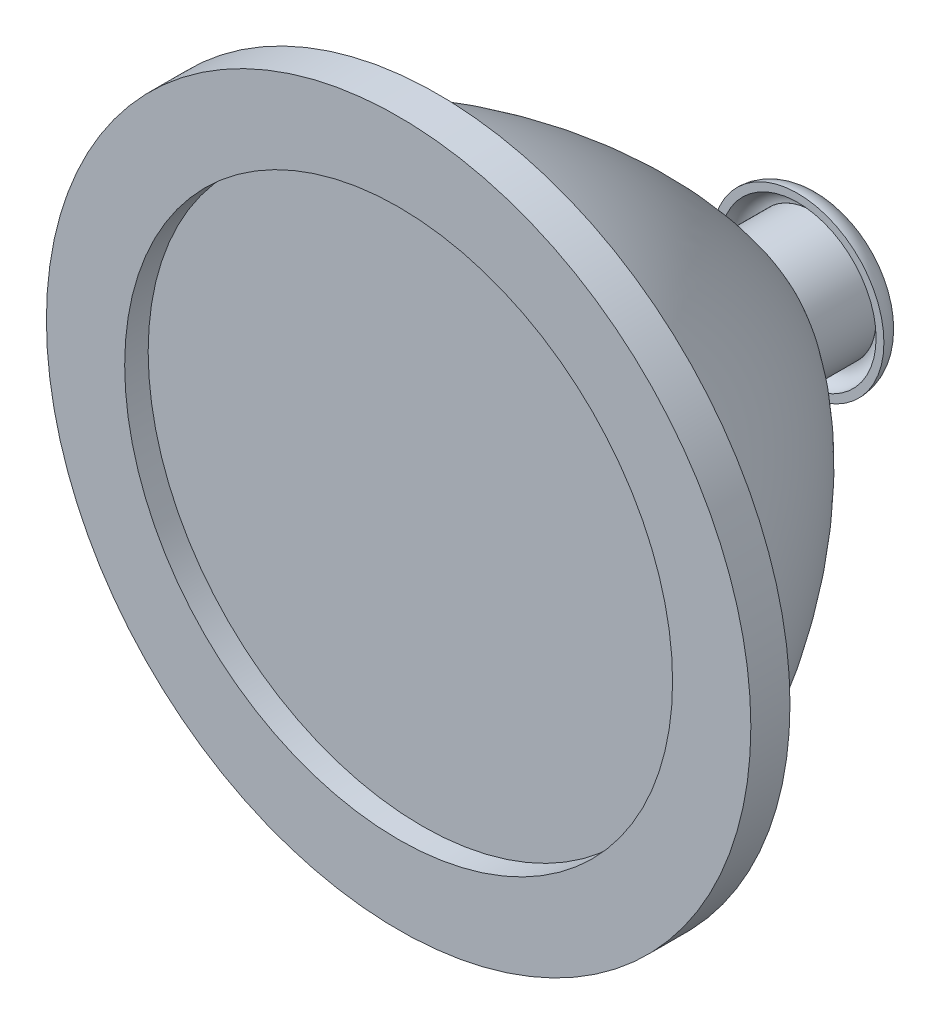
ISO-10303-21;
HEADER;
FILE_DESCRIPTION(('STEP AP214'),'2;1');
FILE_NAME('part.step','',(''),(''),'','','');
FILE_SCHEMA(('AUTOMOTIVE_DESIGN { 1 0 10303 214 1 1 1 1 }'));
ENDSEC;
DATA;
#1=APPLICATION_CONTEXT('core data for automotive mechanical design processes');
#2=APPLICATION_PROTOCOL_DEFINITION('international standard','automotive_design',2000,#1);
#3=PRODUCT_CONTEXT('',#1,'mechanical');
#4=PRODUCT('Part','Part','',(#3));
#5=PRODUCT_RELATED_PRODUCT_CATEGORY('part','',(#4));
#6=PRODUCT_DEFINITION_FORMATION('','',#4);
#7=PRODUCT_DEFINITION_CONTEXT('part definition',#1,'design');
#8=PRODUCT_DEFINITION('design','',#6,#7);
#9=PRODUCT_DEFINITION_SHAPE('','',#8);
#10=(LENGTH_UNIT() NAMED_UNIT(*) SI_UNIT(.MILLI.,.METRE.));
#11=(NAMED_UNIT(*) PLANE_ANGLE_UNIT() SI_UNIT($,.RADIAN.));
#12=(NAMED_UNIT(*) SI_UNIT($,.STERADIAN.) SOLID_ANGLE_UNIT());
#13=UNCERTAINTY_MEASURE_WITH_UNIT(LENGTH_MEASURE(1.E-05),#10,'distance_accuracy_value','');
#14=(GEOMETRIC_REPRESENTATION_CONTEXT(3) GLOBAL_UNCERTAINTY_ASSIGNED_CONTEXT((#13)) GLOBAL_UNIT_ASSIGNED_CONTEXT((#10,
#11,#12)) REPRESENTATION_CONTEXT('',''));
#15=CARTESIAN_POINT('',(0.,0.,0.));
#16=DIRECTION('',(0.,0.,1.));
#17=DIRECTION('',(1.,0.,0.));
#18=AXIS2_PLACEMENT_3D('',#15,#16,#17);
#19=CARTESIAN_POINT('',(0.,0.,-58.42));
#20=DIRECTION('',(0.,0.,1.));
#21=DIRECTION('',(1.,0.,0.));
#22=AXIS2_PLACEMENT_3D('',#19,#20,#21);
#23=TOROIDAL_SURFACE('',#22,10.16,3.81);
#24=CARTESIAN_POINT('',(0.,0.,-58.42));
#25=DIRECTION('',(0.,0.,1.));
#26=DIRECTION('',(1.,0.,0.));
#27=AXIS2_PLACEMENT_3D('',#24,#25,#26);
#28=CIRCLE('',#27,13.97);
#29=CARTESIAN_POINT('',(13.97,0.,-58.42));
#30=VERTEX_POINT('',#29);
#31=EDGE_CURVE('E11',#30,#30,#28,.T.);
#32=ORIENTED_EDGE('',*,*,#31,.F.);
#33=EDGE_LOOP('',(#32));
#34=FACE_BOUND('',#33,.T.);
#35=CARTESIAN_POINT('',(0.,0.,-62.23));
#36=DIRECTION('',(0.,0.,1.));
#37=DIRECTION('',(1.,0.,0.));
#38=AXIS2_PLACEMENT_3D('',#35,#36,#37);
#39=CIRCLE('',#38,10.16);
#40=CARTESIAN_POINT('',(10.16,0.,-62.23));
#41=VERTEX_POINT('',#40);
#42=EDGE_CURVE('E55',#41,#41,#39,.T.);
#43=ORIENTED_EDGE('',*,*,#42,.T.);
#44=EDGE_LOOP('',(#43));
#45=FACE_BOUND('',#44,.T.);
#46=ADVANCED_FACE('F41',(#34,#45),#23,.T.);
#47=CARTESIAN_POINT('',(0.,12.7,-58.42));
#48=DIRECTION('',(0.,0.,1.));
#49=DIRECTION('',(1.,0.,0.));
#50=AXIS2_PLACEMENT_3D('',#47,#48,#49);
#51=PLANE('',#50);
#52=ORIENTED_EDGE('',*,*,#31,.T.);
#53=EDGE_LOOP('',(#52));
#54=FACE_BOUND('',#53,.T.);
#55=CARTESIAN_POINT('',(0.,0.,-58.42));
#56=DIRECTION('',(0.,0.,1.));
#57=DIRECTION('',(1.,0.,0.));
#58=AXIS2_PLACEMENT_3D('',#55,#56,#57);
#59=CIRCLE('',#58,12.7);
#60=CARTESIAN_POINT('',(12.7,0.,-58.42));
#61=VERTEX_POINT('',#60);
#62=EDGE_CURVE('E47',#61,#61,#59,.T.);
#63=ORIENTED_EDGE('',*,*,#62,.F.);
#64=EDGE_LOOP('',(#63));
#65=FACE_BOUND('',#64,.T.);
#66=ADVANCED_FACE('F70',(#54,#65),#51,.T.);
#67=CARTESIAN_POINT('',(0.,0.,-58.42));
#68=DIRECTION('',(0.,0.,1.));
#69=DIRECTION('',(1.,0.,0.));
#70=AXIS2_PLACEMENT_3D('',#67,#68,#69);
#71=TOROIDAL_SURFACE('',#70,10.16,2.54);
#72=ORIENTED_EDGE('',*,*,#62,.T.);
#73=EDGE_LOOP('',(#72));
#74=FACE_BOUND('',#73,.T.);
#75=CARTESIAN_POINT('',(0.,0.,-60.96));
#76=DIRECTION('',(0.,0.,1.));
#77=DIRECTION('',(1.,0.,0.));
#78=AXIS2_PLACEMENT_3D('',#75,#76,#77);
#79=CIRCLE('',#78,10.16);
#80=CARTESIAN_POINT('',(10.16,0.,-60.96));
#81=VERTEX_POINT('',#80);
#82=EDGE_CURVE('E51',#81,#81,#79,.T.);
#83=ORIENTED_EDGE('',*,*,#82,.F.);
#84=EDGE_LOOP('',(#83));
#85=FACE_BOUND('',#84,.T.);
#86=ADVANCED_FACE('F64',(#74,#85),#71,.F.);
#87=CARTESIAN_POINT('',(0.,0.,0.));
#88=DIRECTION('',(0.,0.,1.));
#89=DIRECTION('',(1.,0.,0.));
#90=AXIS2_PLACEMENT_3D('',#87,#88,#89);
#91=CYLINDRICAL_SURFACE('',#90,10.16);
#92=ORIENTED_EDGE('',*,*,#82,.T.);
#93=EDGE_LOOP('',(#92));
#94=FACE_BOUND('',#93,.T.);
#95=ORIENTED_EDGE('',*,*,#42,.F.);
#96=EDGE_LOOP('',(#95));
#97=FACE_BOUND('',#96,.T.);
#98=ADVANCED_FACE('F62',(#94,#97),#91,.F.);
#99=CLOSED_SHELL('',(#46,#66,#86,#98));
#100=MANIFOLD_SOLID_BREP('B2',#99);
#101=CARTESIAN_POINT('',(0.,0.,34.7283102836008));
#102=DIRECTION('',(0.,0.,1.));
#103=DIRECTION('',(1.,0.,0.));
#104=AXIS2_PLACEMENT_3D('',#101,#102,#103);
#105=DEGENERATE_TOROIDAL_SURFACE('',#104,44.680387854501,101.6,.F.);
#106=CARTESIAN_POINT('',(0.,0.,0.));
#107=DIRECTION('',(0.,0.,1.));
#108=DIRECTION('',(1.,0.,0.));
#109=AXIS2_PLACEMENT_3D('',#106,#107,#108);
#110=CIRCLE('',#109,50.8);
#111=CARTESIAN_POINT('',(50.8,0.,0.));
#112=VERTEX_POINT('',#111);
#113=EDGE_CURVE('E109',#112,#112,#110,.T.);
#114=ORIENTED_EDGE('',*,*,#113,.F.);
#115=EDGE_LOOP('',(#114));
#116=FACE_BOUND('',#115,.T.);
#117=CARTESIAN_POINT('',(0.,0.,-50.8));
#118=DIRECTION('',(0.,0.,-1.));
#119=DIRECTION('',(-1.,0.,0.));
#120=AXIS2_PLACEMENT_3D('',#117,#118,#119);
#121=CIRCLE('',#120,10.16);
#122=CARTESIAN_POINT('',(-10.16,0.,-50.8));
#123=VERTEX_POINT('',#122);
#124=EDGE_CURVE('E120',#123,#123,#121,.T.);
#125=ORIENTED_EDGE('',*,*,#124,.F.);
#126=EDGE_LOOP('',(#125));
#127=FACE_BOUND('',#126,.T.);
#128=ADVANCED_FACE('F103',(#116,#127),#105,.F.);
#129=CARTESIAN_POINT('',(0.,0.,34.7283102836008));
#130=DIRECTION('',(0.,0.,1.));
#131=DIRECTION('',(1.,0.,0.));
#132=AXIS2_PLACEMENT_3D('',#129,#130,#131);
#133=DEGENERATE_TOROIDAL_SURFACE('',#132,44.680387854501,95.25,.F.);
#134=CARTESIAN_POINT('',(0.,0.,0.));
#135=DIRECTION('',(0.,0.,1.));
#136=DIRECTION('',(1.,0.,0.));
#137=AXIS2_PLACEMENT_3D('',#134,#135,#136);
#138=CIRCLE('',#137,44.0129431509694);
#139=CARTESIAN_POINT('',(44.0129431509694,0.,0.));
#140=VERTEX_POINT('',#139);
#141=EDGE_CURVE('E146',#140,#140,#138,.T.);
#142=ORIENTED_EDGE('',*,*,#141,.T.);
#143=EDGE_LOOP('',(#142));
#144=FACE_BOUND('',#143,.T.);
#145=CARTESIAN_POINT('',(0.,0.,-44.45));
#146=DIRECTION('',(0.,0.,1.));
#147=DIRECTION('',(1.,0.,0.));
#148=AXIS2_PLACEMENT_3D('',#145,#146,#147);
#149=CIRCLE('',#148,8.26635596071236);
#150=CARTESIAN_POINT('',(8.26635596071236,0.,-44.45));
#151=VERTEX_POINT('',#150);
#152=EDGE_CURVE('E113',#151,#151,#149,.T.);
#153=ORIENTED_EDGE('',*,*,#152,.F.);
#154=EDGE_LOOP('',(#153));
#155=FACE_BOUND('',#154,.T.);
#156=ADVANCED_FACE('F150',(#144,#155),#133,.T.);
#157=CARTESIAN_POINT('',(0.,0.,-44.45));
#158=DIRECTION('',(0.,0.,1.));
#159=DIRECTION('',(1.,0.,0.));
#160=AXIS2_PLACEMENT_3D('',#157,#158,#159);
#161=PLANE('',#160);
#162=CARTESIAN_POINT('',(0.,0.,-44.45));
#163=DIRECTION('',(0.,0.,1.));
#164=DIRECTION('',(1.,0.,0.));
#165=AXIS2_PLACEMENT_3D('',#162,#163,#164);
#166=CIRCLE('',#165,7.62);
#167=CARTESIAN_POINT('',(7.62,0.,-44.45));
#168=VERTEX_POINT('',#167);
#169=EDGE_CURVE('E134',#168,#168,#166,.T.);
#170=ORIENTED_EDGE('',*,*,#169,.F.);
#171=EDGE_LOOP('',(#170));
#172=FACE_BOUND('',#171,.T.);
#173=ORIENTED_EDGE('',*,*,#152,.T.);
#174=EDGE_LOOP('',(#173));
#175=FACE_BOUND('',#174,.T.);
#176=ADVANCED_FACE('F168',(#172,#175),#161,.T.);
#177=CARTESIAN_POINT('',(0.,0.,-60.96));
#178=DIRECTION('',(0.,0.,1.));
#179=DIRECTION('',(1.,0.,0.));
#180=AXIS2_PLACEMENT_3D('',#177,#178,#179);
#181=CYLINDRICAL_SURFACE('',#180,10.16);
#182=CARTESIAN_POINT('',(0.,0.,-60.96));
#183=DIRECTION('',(0.,0.,-1.));
#184=DIRECTION('',(-1.,0.,0.));
#185=AXIS2_PLACEMENT_3D('',#182,#183,#184);
#186=CIRCLE('',#185,10.16);
#187=CARTESIAN_POINT('',(-10.16,0.,-60.96));
#188=VERTEX_POINT('',#187);
#189=EDGE_CURVE('E117',#188,#188,#186,.T.);
#190=ORIENTED_EDGE('',*,*,#189,.F.);
#191=EDGE_LOOP('',(#190));
#192=FACE_BOUND('',#191,.T.);
#193=ORIENTED_EDGE('',*,*,#124,.T.);
#194=EDGE_LOOP('',(#193));
#195=FACE_BOUND('',#194,.T.);
#196=ADVANCED_FACE('F173',(#192,#195),#181,.T.);
#197=CARTESIAN_POINT('',(0.,0.,-60.96));
#198=DIRECTION('',(0.,0.,-1.));
#199=DIRECTION('',(-1.,0.,0.));
#200=AXIS2_PLACEMENT_3D('',#197,#198,#199);
#201=PLANE('',#200);
#202=CARTESIAN_POINT('',(0.,0.,-60.96));
#203=DIRECTION('',(0.,0.,1.));
#204=DIRECTION('',(1.,0.,0.));
#205=AXIS2_PLACEMENT_3D('',#202,#203,#204);
#206=CIRCLE('',#205,6.74624);
#207=CARTESIAN_POINT('',(6.74624,0.,-60.96));
#208=VERTEX_POINT('',#207);
#209=EDGE_CURVE('E123',#208,#208,#206,.T.);
#210=ORIENTED_EDGE('',*,*,#209,.T.);
#211=EDGE_LOOP('',(#210));
#212=FACE_BOUND('',#211,.T.);
#213=ORIENTED_EDGE('',*,*,#189,.T.);
#214=EDGE_LOOP('',(#213));
#215=FACE_BOUND('',#214,.T.);
#216=ADVANCED_FACE('F175',(#212,#215),#201,.T.);
#217=CARTESIAN_POINT('',(0.,0.,-44.45));
#218=DIRECTION('',(0.,0.,1.));
#219=DIRECTION('',(1.,0.,0.));
#220=AXIS2_PLACEMENT_3D('',#217,#218,#219);
#221=CYLINDRICAL_SURFACE('',#220,6.74624);
#222=ORIENTED_EDGE('',*,*,#209,.F.);
#223=EDGE_LOOP('',(#222));
#224=FACE_BOUND('',#223,.T.);
#225=CARTESIAN_POINT('',(0.,0.,-49.53));
#226=DIRECTION('',(0.,0.,1.));
#227=DIRECTION('',(1.,0.,0.));
#228=AXIS2_PLACEMENT_3D('',#225,#226,#227);
#229=CIRCLE('',#228,6.74624);
#230=CARTESIAN_POINT('',(6.74624,0.,-49.53));
#231=VERTEX_POINT('',#230);
#232=EDGE_CURVE('E128',#231,#231,#229,.T.);
#233=ORIENTED_EDGE('',*,*,#232,.T.);
#234=EDGE_LOOP('',(#233));
#235=FACE_BOUND('',#234,.T.);
#236=ADVANCED_FACE('F182',(#224,#235),#221,.F.);
#237=CARTESIAN_POINT('',(6.74624,0.,-49.53));
#238=DIRECTION('',(0.,0.,-1.));
#239=DIRECTION('',(-1.,0.,0.));
#240=AXIS2_PLACEMENT_3D('',#237,#238,#239);
#241=PLANE('',#240);
#242=ORIENTED_EDGE('',*,*,#232,.F.);
#243=EDGE_LOOP('',(#242));
#244=FACE_BOUND('',#243,.T.);
#245=CARTESIAN_POINT('',(0.,0.,-49.53));
#246=DIRECTION('',(0.,0.,1.));
#247=DIRECTION('',(1.,0.,0.));
#248=AXIS2_PLACEMENT_3D('',#245,#246,#247);
#249=CIRCLE('',#248,7.62);
#250=CARTESIAN_POINT('',(7.62,0.,-49.53));
#251=VERTEX_POINT('',#250);
#252=EDGE_CURVE('E131',#251,#251,#249,.T.);
#253=ORIENTED_EDGE('',*,*,#252,.T.);
#254=EDGE_LOOP('',(#253));
#255=FACE_BOUND('',#254,.T.);
#256=ADVANCED_FACE('F190',(#244,#255),#241,.F.);
#257=CARTESIAN_POINT('',(0.,0.,-44.45));
#258=DIRECTION('',(0.,0.,1.));
#259=DIRECTION('',(1.,0.,0.));
#260=AXIS2_PLACEMENT_3D('',#257,#258,#259);
#261=CYLINDRICAL_SURFACE('',#260,7.62);
#262=ORIENTED_EDGE('',*,*,#252,.F.);
#263=EDGE_LOOP('',(#262));
#264=FACE_BOUND('',#263,.T.);
#265=ORIENTED_EDGE('',*,*,#169,.T.);
#266=EDGE_LOOP('',(#265));
#267=FACE_BOUND('',#266,.T.);
#268=ADVANCED_FACE('F194',(#264,#267),#261,.F.);
#269=CARTESIAN_POINT('',(0.,0.,0.));
#270=DIRECTION('',(0.,0.,1.));
#271=DIRECTION('',(1.,0.,0.));
#272=AXIS2_PLACEMENT_3D('',#269,#270,#271);
#273=PLANE('',#272);
#274=CARTESIAN_POINT('',(0.,0.,0.));
#275=DIRECTION('',(0.,0.,1.));
#276=DIRECTION('',(1.,0.,0.));
#277=AXIS2_PLACEMENT_3D('',#274,#275,#276);
#278=CIRCLE('',#277,57.15);
#279=CARTESIAN_POINT('',(57.15,0.,0.));
#280=VERTEX_POINT('',#279);
#281=EDGE_CURVE('E138',#280,#280,#278,.T.);
#282=ORIENTED_EDGE('',*,*,#281,.F.);
#283=EDGE_LOOP('',(#282));
#284=FACE_BOUND('',#283,.T.);
#285=ORIENTED_EDGE('',*,*,#113,.T.);
#286=EDGE_LOOP('',(#285));
#287=FACE_BOUND('',#286,.T.);
#288=ADVANCED_FACE('F198',(#284,#287),#273,.F.);
#289=CARTESIAN_POINT('',(0.,0.,6.35));
#290=DIRECTION('',(0.,0.,1.));
#291=DIRECTION('',(1.,0.,0.));
#292=AXIS2_PLACEMENT_3D('',#289,#290,#291);
#293=PLANE('',#292);
#294=CARTESIAN_POINT('',(0.,0.,6.35));
#295=DIRECTION('',(0.,0.,1.));
#296=DIRECTION('',(1.,0.,0.));
#297=AXIS2_PLACEMENT_3D('',#294,#295,#296);
#298=CIRCLE('',#297,57.15);
#299=CARTESIAN_POINT('',(57.15,0.,6.35));
#300=VERTEX_POINT('',#299);
#301=EDGE_CURVE('E137',#300,#300,#298,.T.);
#302=ORIENTED_EDGE('',*,*,#301,.T.);
#303=EDGE_LOOP('',(#302));
#304=FACE_BOUND('',#303,.T.);
#305=CARTESIAN_POINT('',(0.,0.,6.35));
#306=DIRECTION('',(0.,0.,1.));
#307=DIRECTION('',(1.,0.,0.));
#308=AXIS2_PLACEMENT_3D('',#305,#306,#307);
#309=CIRCLE('',#308,44.45);
#310=CARTESIAN_POINT('',(44.45,0.,6.35));
#311=VERTEX_POINT('',#310);
#312=EDGE_CURVE('E141',#311,#311,#309,.T.);
#313=ORIENTED_EDGE('',*,*,#312,.F.);
#314=EDGE_LOOP('',(#313));
#315=FACE_BOUND('',#314,.T.);
#316=ADVANCED_FACE('F203',(#304,#315),#293,.T.);
#317=CARTESIAN_POINT('',(0.,0.,6.35));
#318=DIRECTION('',(0.,0.,-1.));
#319=DIRECTION('',(-1.,0.,0.));
#320=AXIS2_PLACEMENT_3D('',#317,#318,#319);
#321=CYLINDRICAL_SURFACE('',#320,57.15);
#322=ORIENTED_EDGE('',*,*,#301,.F.);
#323=EDGE_LOOP('',(#322));
#324=FACE_BOUND('',#323,.T.);
#325=ORIENTED_EDGE('',*,*,#281,.T.);
#326=EDGE_LOOP('',(#325));
#327=FACE_BOUND('',#326,.T.);
#328=ADVANCED_FACE('F200',(#324,#327),#321,.T.);
#329=CARTESIAN_POINT('',(0.,0.,6.35));
#330=DIRECTION('',(0.,0.,-1.));
#331=DIRECTION('',(-1.,0.,0.));
#332=AXIS2_PLACEMENT_3D('',#329,#330,#331);
#333=CYLINDRICAL_SURFACE('',#332,44.45);
#334=CARTESIAN_POINT('',(0.,0.,2.54));
#335=DIRECTION('',(0.,0.,1.));
#336=DIRECTION('',(1.,0.,0.));
#337=AXIS2_PLACEMENT_3D('',#334,#335,#336);
#338=CIRCLE('',#337,44.45);
#339=CARTESIAN_POINT('',(44.45,0.,2.54));
#340=VERTEX_POINT('',#339);
#341=EDGE_CURVE('E40',#340,#340,#338,.T.);
#342=ORIENTED_EDGE('',*,*,#341,.F.);
#343=EDGE_LOOP('',(#342));
#344=FACE_BOUND('',#343,.T.);
#345=ORIENTED_EDGE('',*,*,#312,.T.);
#346=EDGE_LOOP('',(#345));
#347=FACE_BOUND('',#346,.T.);
#348=ADVANCED_FACE('F160',(#344,#347),#333,.F.);
#349=CARTESIAN_POINT('',(0.,0.,2.54));
#350=DIRECTION('',(0.,0.,1.));
#351=DIRECTION('',(1.,0.,0.));
#352=AXIS2_PLACEMENT_3D('',#349,#350,#351);
#353=PLANE('',#352);
#354=ORIENTED_EDGE('',*,*,#341,.T.);
#355=EDGE_LOOP('',(#354));
#356=FACE_BOUND('',#355,.T.);
#357=ADVANCED_FACE('F155',(#356),#353,.T.);
#358=CARTESIAN_POINT('',(0.,0.,0.));
#359=DIRECTION('',(0.,0.,1.));
#360=DIRECTION('',(1.,0.,0.));
#361=AXIS2_PLACEMENT_3D('',#358,#359,#360);
#362=PLANE('',#361);
#363=ORIENTED_EDGE('',*,*,#141,.F.);
#364=EDGE_LOOP('',(#363));
#365=FACE_BOUND('',#364,.T.);
#366=ADVANCED_FACE('F153',(#365),#362,.F.);
#367=CLOSED_SHELL('',(#128,#156,#176,#196,#216,#236,#256,#268,#288,#316,#328,#348,#357,#366));
#368=MANIFOLD_SOLID_BREP('B6',#367);
#369=ADVANCED_BREP_SHAPE_REPRESENTATION('',(#18,#100,#368),#14);
#370=SHAPE_DEFINITION_REPRESENTATION(#9,#369);
ENDSEC;
END-ISO-10303-21;
